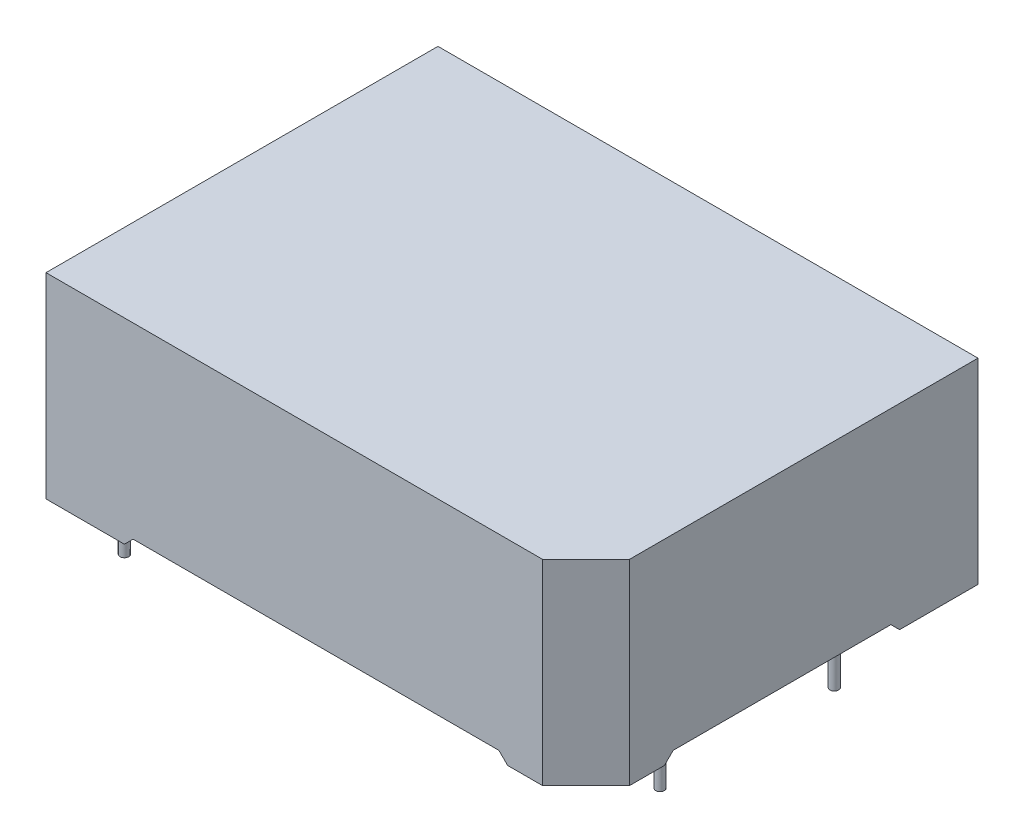
ISO-10303-21;
HEADER;
FILE_DESCRIPTION(('STEP AP214'),'2;1');
FILE_NAME('part.step','',(''),(''),'','','');
FILE_SCHEMA(('AUTOMOTIVE_DESIGN { 1 0 10303 214 1 1 1 1 }'));
ENDSEC;
DATA;
#1=APPLICATION_CONTEXT('core data for automotive mechanical design processes');
#2=APPLICATION_PROTOCOL_DEFINITION('international standard','automotive_design',2000,#1);
#3=PRODUCT_CONTEXT('',#1,'mechanical');
#4=PRODUCT('Part','Part','',(#3));
#5=PRODUCT_RELATED_PRODUCT_CATEGORY('part','',(#4));
#6=PRODUCT_DEFINITION_FORMATION('','',#4);
#7=PRODUCT_DEFINITION_CONTEXT('part definition',#1,'design');
#8=PRODUCT_DEFINITION('design','',#6,#7);
#9=PRODUCT_DEFINITION_SHAPE('','',#8);
#10=(LENGTH_UNIT() NAMED_UNIT(*) SI_UNIT(.MILLI.,.METRE.));
#11=(NAMED_UNIT(*) PLANE_ANGLE_UNIT() SI_UNIT($,.RADIAN.));
#12=(NAMED_UNIT(*) SI_UNIT($,.STERADIAN.) SOLID_ANGLE_UNIT());
#13=UNCERTAINTY_MEASURE_WITH_UNIT(LENGTH_MEASURE(1.E-05),#10,'distance_accuracy_value','');
#14=(GEOMETRIC_REPRESENTATION_CONTEXT(3) GLOBAL_UNCERTAINTY_ASSIGNED_CONTEXT((#13)) GLOBAL_UNIT_ASSIGNED_CONTEXT((#10,
#11,#12)) REPRESENTATION_CONTEXT('',''));
#15=CARTESIAN_POINT('',(0.,0.,0.));
#16=DIRECTION('',(0.,0.,1.));
#17=DIRECTION('',(1.,0.,0.));
#18=AXIS2_PLACEMENT_3D('',#15,#16,#17);
#19=CARTESIAN_POINT('',(27.,-6.,-10.));
#20=DIRECTION('',(0.,1.,0.));
#21=DIRECTION('',(0.,0.,1.));
#22=AXIS2_PLACEMENT_3D('',#19,#20,#21);
#23=CYLINDRICAL_SURFACE('',#22,0.499999999999999);
#24=CARTESIAN_POINT('',(27.,1.,-10.));
#25=DIRECTION('',(0.,-1.,0.));
#26=DIRECTION('',(0.,0.,-1.));
#27=AXIS2_PLACEMENT_3D('',#24,#25,#26);
#28=CIRCLE('',#27,0.499999999999999);
#29=CARTESIAN_POINT('',(27.,1.,-10.5));
#30=VERTEX_POINT('',#29);
#31=EDGE_CURVE('E10',#30,#30,#28,.T.);
#32=ORIENTED_EDGE('',*,*,#31,.T.);
#33=EDGE_LOOP('',(#32));
#34=FACE_BOUND('',#33,.T.);
#35=CARTESIAN_POINT('',(27.,-6.,-10.));
#36=DIRECTION('',(0.,-1.,0.));
#37=DIRECTION('',(0.,0.,1.));
#38=AXIS2_PLACEMENT_3D('',#35,#36,#37);
#39=CIRCLE('',#38,0.499999999999999);
#40=CARTESIAN_POINT('',(27.,-6.,-9.5));
#41=VERTEX_POINT('',#40);
#42=EDGE_CURVE('E486',#41,#41,#39,.T.);
#43=ORIENTED_EDGE('',*,*,#42,.F.);
#44=EDGE_LOOP('',(#43));
#45=FACE_BOUND('',#44,.T.);
#46=ADVANCED_FACE('F15',(#34,#45),#23,.T.);
#47=CARTESIAN_POINT('',(-27.,-6.,17.5));
#48=DIRECTION('',(0.,1.,0.));
#49=DIRECTION('',(0.,0.,1.));
#50=AXIS2_PLACEMENT_3D('',#47,#48,#49);
#51=CYLINDRICAL_SURFACE('',#50,0.5);
#52=CARTESIAN_POINT('',(-27.,1.,17.5));
#53=DIRECTION('',(0.,-1.,0.));
#54=DIRECTION('',(0.,0.,-1.));
#55=AXIS2_PLACEMENT_3D('',#52,#53,#54);
#56=CIRCLE('',#55,0.5);
#57=CARTESIAN_POINT('',(-27.,1.,17.));
#58=VERTEX_POINT('',#57);
#59=EDGE_CURVE('E25',#58,#58,#56,.T.);
#60=ORIENTED_EDGE('',*,*,#59,.T.);
#61=EDGE_LOOP('',(#60));
#62=FACE_BOUND('',#61,.T.);
#63=CARTESIAN_POINT('',(-27.,-6.,17.5));
#64=DIRECTION('',(0.,-1.,0.));
#65=DIRECTION('',(0.,0.,-1.));
#66=AXIS2_PLACEMENT_3D('',#63,#64,#65);
#67=CIRCLE('',#66,0.5);
#68=CARTESIAN_POINT('',(-27.,-6.,17.));
#69=VERTEX_POINT('',#68);
#70=EDGE_CURVE('E482',#69,#69,#67,.T.);
#71=ORIENTED_EDGE('',*,*,#70,.F.);
#72=EDGE_LOOP('',(#71));
#73=FACE_BOUND('',#72,.T.);
#74=ADVANCED_FACE('F494',(#62,#73),#51,.T.);
#75=CARTESIAN_POINT('',(-27.,-6.,0.));
#76=DIRECTION('',(0.,1.,0.));
#77=DIRECTION('',(0.,0.,1.));
#78=AXIS2_PLACEMENT_3D('',#75,#76,#77);
#79=CYLINDRICAL_SURFACE('',#78,0.499999999999999);
#80=CARTESIAN_POINT('',(-27.,1.,0.));
#81=DIRECTION('',(0.,-1.,0.));
#82=DIRECTION('',(0.,0.,-1.));
#83=AXIS2_PLACEMENT_3D('',#80,#81,#82);
#84=CIRCLE('',#83,0.499999999999999);
#85=CARTESIAN_POINT('',(-27.,1.,-0.499999999999999));
#86=VERTEX_POINT('',#85);
#87=EDGE_CURVE('E474',#86,#86,#84,.T.);
#88=ORIENTED_EDGE('',*,*,#87,.T.);
#89=EDGE_LOOP('',(#88));
#90=FACE_BOUND('',#89,.T.);
#91=CARTESIAN_POINT('',(-27.,-6.,0.));
#92=DIRECTION('',(0.,-1.,0.));
#93=DIRECTION('',(0.,0.,-1.));
#94=AXIS2_PLACEMENT_3D('',#91,#92,#93);
#95=CIRCLE('',#94,0.499999999999999);
#96=CARTESIAN_POINT('',(-27.,-6.,-0.499999999999999));
#97=VERTEX_POINT('',#96);
#98=EDGE_CURVE('E477',#97,#97,#95,.T.);
#99=ORIENTED_EDGE('',*,*,#98,.F.);
#100=EDGE_LOOP('',(#99));
#101=FACE_BOUND('',#100,.T.);
#102=ADVANCED_FACE('F503',(#90,#101),#79,.T.);
#103=CARTESIAN_POINT('',(27.,-6.,10.));
#104=DIRECTION('',(0.,1.,0.));
#105=DIRECTION('',(0.,0.,1.));
#106=AXIS2_PLACEMENT_3D('',#103,#104,#105);
#107=CYLINDRICAL_SURFACE('',#106,0.499999999999999);
#108=CARTESIAN_POINT('',(27.,1.,10.));
#109=DIRECTION('',(0.,-1.,0.));
#110=DIRECTION('',(0.,0.,-1.));
#111=AXIS2_PLACEMENT_3D('',#108,#109,#110);
#112=CIRCLE('',#111,0.499999999999999);
#113=CARTESIAN_POINT('',(27.,1.,9.5));
#114=VERTEX_POINT('',#113);
#115=EDGE_CURVE('E453',#114,#114,#112,.T.);
#116=ORIENTED_EDGE('',*,*,#115,.T.);
#117=EDGE_LOOP('',(#116));
#118=FACE_BOUND('',#117,.T.);
#119=CARTESIAN_POINT('',(27.,-6.,10.));
#120=DIRECTION('',(0.,-1.,0.));
#121=DIRECTION('',(0.,0.,-1.));
#122=AXIS2_PLACEMENT_3D('',#119,#120,#121);
#123=CIRCLE('',#122,0.499999999999999);
#124=CARTESIAN_POINT('',(27.,-6.,9.5));
#125=VERTEX_POINT('',#124);
#126=EDGE_CURVE('E410',#125,#125,#123,.T.);
#127=ORIENTED_EDGE('',*,*,#126,.F.);
#128=EDGE_LOOP('',(#127));
#129=FACE_BOUND('',#128,.T.);
#130=ADVANCED_FACE('F509',(#118,#129),#107,.T.);
#131=CARTESIAN_POINT('',(-31.,0.,22.5));
#132=DIRECTION('',(0.,1.,0.));
#133=DIRECTION('',(0.,0.,1.));
#134=AXIS2_PLACEMENT_3D('',#131,#132,#133);
#135=PLANE('',#134);
#136=DIRECTION('',(0.,0.,1.));
#137=VECTOR('',#136,1.);
#138=CARTESIAN_POINT('',(30.,0.,12.5));
#139=LINE('',#138,#137);
#140=CARTESIAN_POINT('',(30.,0.,13.5));
#141=VERTEX_POINT('',#140);
#142=CARTESIAN_POINT('',(30.,0.,17.085786437627));
#143=VERTEX_POINT('',#142);
#144=EDGE_CURVE('E34',#141,#143,#139,.T.);
#145=ORIENTED_EDGE('',*,*,#144,.F.);
#146=DIRECTION('',(1.,0.,0.));
#147=VECTOR('',#146,1.);
#148=CARTESIAN_POINT('',(-31.,0.,13.5));
#149=LINE('',#148,#147);
#150=CARTESIAN_POINT('',(31.,0.,13.5));
#151=VERTEX_POINT('',#150);
#152=EDGE_CURVE('E449',#141,#151,#149,.T.);
#153=ORIENTED_EDGE('',*,*,#152,.T.);
#154=DIRECTION('',(0.,0.,-1.));
#155=VECTOR('',#154,1.);
#156=CARTESIAN_POINT('',(31.,0.,-22.5));
#157=LINE('',#156,#155);
#158=CARTESIAN_POINT('',(31.,0.,17.5000000000001));
#159=VERTEX_POINT('',#158);
#160=EDGE_CURVE('E343',#159,#151,#157,.T.);
#161=ORIENTED_EDGE('',*,*,#160,.F.);
#162=DIRECTION('',(0.707106781186551,0.,-0.707106781186544));
#163=VECTOR('',#162,1.);
#164=CARTESIAN_POINT('',(31.,0.,17.5000000000001));
#165=LINE('',#164,#163);
#166=CARTESIAN_POINT('',(26.,0.,22.5));
#167=VERTEX_POINT('',#166);
#168=EDGE_CURVE('E416',#167,#159,#165,.T.);
#169=ORIENTED_EDGE('',*,*,#168,.F.);
#170=DIRECTION('',(1.,0.,0.));
#171=VECTOR('',#170,1.);
#172=CARTESIAN_POINT('',(-31.,0.,22.5));
#173=LINE('',#172,#171);
#174=CARTESIAN_POINT('',(22.,0.,22.5));
#175=VERTEX_POINT('',#174);
#176=EDGE_CURVE('E405',#175,#167,#173,.T.);
#177=ORIENTED_EDGE('',*,*,#176,.F.);
#178=DIRECTION('',(0.,0.,-1.));
#179=VECTOR('',#178,1.);
#180=CARTESIAN_POINT('',(22.,0.,22.5));
#181=LINE('',#180,#179);
#182=CARTESIAN_POINT('',(22.,0.,21.5));
#183=VERTEX_POINT('',#182);
#184=EDGE_CURVE('E379',#175,#183,#181,.T.);
#185=ORIENTED_EDGE('',*,*,#184,.T.);
#186=DIRECTION('',(-1.,0.,0.));
#187=VECTOR('',#186,1.);
#188=CARTESIAN_POINT('',(25.5857864376269,0.,21.5));
#189=LINE('',#188,#187);
#190=CARTESIAN_POINT('',(25.5857864376269,0.,21.5));
#191=VERTEX_POINT('',#190);
#192=EDGE_CURVE('E353',#191,#183,#189,.T.);
#193=ORIENTED_EDGE('',*,*,#192,.F.);
#194=DIRECTION('',(-0.707106781186551,0.,0.707106781186544));
#195=VECTOR('',#194,1.);
#196=CARTESIAN_POINT('',(30.,0.,17.085786437627));
#197=LINE('',#196,#195);
#198=EDGE_CURVE('E365',#143,#191,#197,.T.);
#199=ORIENTED_EDGE('',*,*,#198,.F.);
#200=EDGE_LOOP('',(#145,#153,#161,#169,#177,#185,#193,#199));
#201=FACE_BOUND('',#200,.T.);
#202=ADVANCED_FACE('F450',(#201),#135,.F.);
#203=CARTESIAN_POINT('',(-31.,0.,22.5));
#204=DIRECTION('',(0.,1.,0.));
#205=DIRECTION('',(0.,0.,1.));
#206=AXIS2_PLACEMENT_3D('',#203,#204,#205);
#207=PLANE('',#206);
#208=DIRECTION('',(1.,0.,0.));
#209=VECTOR('',#208,1.);
#210=CARTESIAN_POINT('',(21.,0.,-21.5));
#211=LINE('',#210,#209);
#212=CARTESIAN_POINT('',(22.,0.,-21.5));
#213=VERTEX_POINT('',#212);
#214=CARTESIAN_POINT('',(30.,0.,-21.5));
#215=VERTEX_POINT('',#214);
#216=EDGE_CURVE('E267',#213,#215,#211,.T.);
#217=ORIENTED_EDGE('',*,*,#216,.F.);
#218=DIRECTION('',(0.,0.,-1.));
#219=VECTOR('',#218,1.);
#220=CARTESIAN_POINT('',(22.,0.,22.5));
#221=LINE('',#220,#219);
#222=CARTESIAN_POINT('',(22.,0.,-22.5));
#223=VERTEX_POINT('',#222);
#224=EDGE_CURVE('E376',#213,#223,#221,.T.);
#225=ORIENTED_EDGE('',*,*,#224,.T.);
#226=DIRECTION('',(-1.,0.,0.));
#227=VECTOR('',#226,1.);
#228=CARTESIAN_POINT('',(-31.,0.,-22.5));
#229=LINE('',#228,#227);
#230=CARTESIAN_POINT('',(31.,0.,-22.5));
#231=VERTEX_POINT('',#230);
#232=EDGE_CURVE('E357',#231,#223,#229,.T.);
#233=ORIENTED_EDGE('',*,*,#232,.F.);
#234=DIRECTION('',(0.,0.,-1.));
#235=VECTOR('',#234,1.);
#236=CARTESIAN_POINT('',(31.,0.,-22.5));
#237=LINE('',#236,#235);
#238=CARTESIAN_POINT('',(31.,0.,-13.5));
#239=VERTEX_POINT('',#238);
#240=EDGE_CURVE('E382',#239,#231,#237,.T.);
#241=ORIENTED_EDGE('',*,*,#240,.F.);
#242=DIRECTION('',(-1.,0.,0.));
#243=VECTOR('',#242,1.);
#244=CARTESIAN_POINT('',(-31.,0.,-13.5));
#245=LINE('',#244,#243);
#246=CARTESIAN_POINT('',(30.,0.,-13.5));
#247=VERTEX_POINT('',#246);
#248=EDGE_CURVE('E380',#239,#247,#245,.T.);
#249=ORIENTED_EDGE('',*,*,#248,.T.);
#250=DIRECTION('',(0.,0.,1.));
#251=VECTOR('',#250,1.);
#252=CARTESIAN_POINT('',(30.,0.,-21.5));
#253=LINE('',#252,#251);
#254=EDGE_CURVE('E257',#215,#247,#253,.T.);
#255=ORIENTED_EDGE('',*,*,#254,.F.);
#256=EDGE_LOOP('',(#217,#225,#233,#241,#249,#255));
#257=FACE_BOUND('',#256,.T.);
#258=ADVANCED_FACE('F516',(#257),#207,.F.);
#259=CARTESIAN_POINT('',(-31.,0.,22.5));
#260=DIRECTION('',(0.,1.,0.));
#261=DIRECTION('',(0.,0.,1.));
#262=AXIS2_PLACEMENT_3D('',#259,#260,#261);
#263=PLANE('',#262);
#264=DIRECTION('',(-1.,0.,0.));
#265=VECTOR('',#264,1.);
#266=CARTESIAN_POINT('',(-31.,0.,-22.5));
#267=LINE('',#266,#265);
#268=CARTESIAN_POINT('',(-22.,0.,-22.5));
#269=VERTEX_POINT('',#268);
#270=CARTESIAN_POINT('',(-31.,0.,-22.5));
#271=VERTEX_POINT('',#270);
#272=EDGE_CURVE('E340',#269,#271,#267,.T.);
#273=ORIENTED_EDGE('',*,*,#272,.F.);
#274=DIRECTION('',(0.,0.,1.));
#275=VECTOR('',#274,1.);
#276=CARTESIAN_POINT('',(-22.,0.,22.5));
#277=LINE('',#276,#275);
#278=CARTESIAN_POINT('',(-22.,0.,-21.5));
#279=VERTEX_POINT('',#278);
#280=EDGE_CURVE('E337',#269,#279,#277,.T.);
#281=ORIENTED_EDGE('',*,*,#280,.T.);
#282=DIRECTION('',(1.,0.,0.));
#283=VECTOR('',#282,1.);
#284=CARTESIAN_POINT('',(-30.,0.,-21.5));
#285=LINE('',#284,#283);
#286=CARTESIAN_POINT('',(-30.,0.,-21.5));
#287=VERTEX_POINT('',#286);
#288=EDGE_CURVE('E271',#287,#279,#285,.T.);
#289=ORIENTED_EDGE('',*,*,#288,.F.);
#290=DIRECTION('',(0.,0.,-1.));
#291=VECTOR('',#290,1.);
#292=CARTESIAN_POINT('',(-30.,0.,-12.5));
#293=LINE('',#292,#291);
#294=CARTESIAN_POINT('',(-30.,0.,-13.5));
#295=VERTEX_POINT('',#294);
#296=EDGE_CURVE('E281',#295,#287,#293,.T.);
#297=ORIENTED_EDGE('',*,*,#296,.F.);
#298=DIRECTION('',(-1.,0.,0.));
#299=VECTOR('',#298,1.);
#300=CARTESIAN_POINT('',(-31.,0.,-13.5));
#301=LINE('',#300,#299);
#302=CARTESIAN_POINT('',(-31.,0.,-13.5));
#303=VERTEX_POINT('',#302);
#304=EDGE_CURVE('E301',#295,#303,#301,.T.);
#305=ORIENTED_EDGE('',*,*,#304,.T.);
#306=DIRECTION('',(0.,0.,1.));
#307=VECTOR('',#306,1.);
#308=CARTESIAN_POINT('',(-31.,0.,-22.5));
#309=LINE('',#308,#307);
#310=EDGE_CURVE('E314',#271,#303,#309,.T.);
#311=ORIENTED_EDGE('',*,*,#310,.F.);
#312=EDGE_LOOP('',(#273,#281,#289,#297,#305,#311));
#313=FACE_BOUND('',#312,.T.);
#314=ADVANCED_FACE('F519',(#313),#263,.F.);
#315=CARTESIAN_POINT('',(-31.,0.,22.5));
#316=DIRECTION('',(0.,1.,0.));
#317=DIRECTION('',(0.,0.,1.));
#318=AXIS2_PLACEMENT_3D('',#315,#316,#317);
#319=PLANE('',#318);
#320=DIRECTION('',(0.,0.,1.));
#321=VECTOR('',#320,1.);
#322=CARTESIAN_POINT('',(-31.,0.,-22.5));
#323=LINE('',#322,#321);
#324=CARTESIAN_POINT('',(-31.,0.,13.5));
#325=VERTEX_POINT('',#324);
#326=CARTESIAN_POINT('',(-31.,0.,22.5));
#327=VERTEX_POINT('',#326);
#328=EDGE_CURVE('E297',#325,#327,#323,.T.);
#329=ORIENTED_EDGE('',*,*,#328,.F.);
#330=DIRECTION('',(1.,0.,0.));
#331=VECTOR('',#330,1.);
#332=CARTESIAN_POINT('',(-31.,0.,13.5));
#333=LINE('',#332,#331);
#334=CARTESIAN_POINT('',(-30.,0.,13.5));
#335=VERTEX_POINT('',#334);
#336=EDGE_CURVE('E294',#325,#335,#333,.T.);
#337=ORIENTED_EDGE('',*,*,#336,.T.);
#338=DIRECTION('',(0.,0.,-1.));
#339=VECTOR('',#338,1.);
#340=CARTESIAN_POINT('',(-30.,0.,21.5));
#341=LINE('',#340,#339);
#342=CARTESIAN_POINT('',(-30.,0.,21.5));
#343=VERTEX_POINT('',#342);
#344=EDGE_CURVE('E284',#343,#335,#341,.T.);
#345=ORIENTED_EDGE('',*,*,#344,.F.);
#346=DIRECTION('',(-1.,0.,0.));
#347=VECTOR('',#346,1.);
#348=CARTESIAN_POINT('',(-21.,0.,21.5));
#349=LINE('',#348,#347);
#350=CARTESIAN_POINT('',(-22.,0.,21.5));
#351=VERTEX_POINT('',#350);
#352=EDGE_CURVE('E207',#351,#343,#349,.T.);
#353=ORIENTED_EDGE('',*,*,#352,.F.);
#354=DIRECTION('',(0.,0.,1.));
#355=VECTOR('',#354,1.);
#356=CARTESIAN_POINT('',(-22.,0.,22.5));
#357=LINE('',#356,#355);
#358=CARTESIAN_POINT('',(-22.,0.,22.5));
#359=VERTEX_POINT('',#358);
#360=EDGE_CURVE('E206',#351,#359,#357,.T.);
#361=ORIENTED_EDGE('',*,*,#360,.T.);
#362=DIRECTION('',(1.,0.,0.));
#363=VECTOR('',#362,1.);
#364=CARTESIAN_POINT('',(-31.,0.,22.5));
#365=LINE('',#364,#363);
#366=EDGE_CURVE('E398',#327,#359,#365,.T.);
#367=ORIENTED_EDGE('',*,*,#366,.F.);
#368=EDGE_LOOP('',(#329,#337,#345,#353,#361,#367));
#369=FACE_BOUND('',#368,.T.);
#370=ADVANCED_FACE('F295',(#369),#319,.F.);
#371=CARTESIAN_POINT('',(-31.,22.5,-22.5));
#372=DIRECTION('',(1.,0.,0.));
#373=DIRECTION('',(0.,0.,-1.));
#374=AXIS2_PLACEMENT_3D('',#371,#372,#373);
#375=PLANE('',#374);
#376=DIRECTION('',(0.,0.,-1.));
#377=VECTOR('',#376,1.);
#378=CARTESIAN_POINT('',(-31.,1.,12.5));
#379=LINE('',#378,#377);
#380=CARTESIAN_POINT('',(-31.,1.,12.5));
#381=VERTEX_POINT('',#380);
#382=CARTESIAN_POINT('',(-31.,1.,-12.5));
#383=VERTEX_POINT('',#382);
#384=EDGE_CURVE('E219',#381,#383,#379,.T.);
#385=ORIENTED_EDGE('',*,*,#384,.F.);
#386=DIRECTION('',(0.,-0.707106781186548,0.707106781186548));
#387=VECTOR('',#386,1.);
#388=CARTESIAN_POINT('',(-31.,0.999999999999994,12.5));
#389=LINE('',#388,#387);
#390=EDGE_CURVE('E304',#381,#325,#389,.T.);
#391=ORIENTED_EDGE('',*,*,#390,.T.);
#392=ORIENTED_EDGE('',*,*,#328,.T.);
#393=DIRECTION('',(0.,-1.,0.));
#394=VECTOR('',#393,1.);
#395=CARTESIAN_POINT('',(-31.,22.5,22.5));
#396=LINE('',#395,#394);
#397=CARTESIAN_POINT('',(-31.,22.5,22.5));
#398=VERTEX_POINT('',#397);
#399=EDGE_CURVE('E399',#398,#327,#396,.T.);
#400=ORIENTED_EDGE('',*,*,#399,.F.);
#401=DIRECTION('',(0.,0.,1.));
#402=VECTOR('',#401,1.);
#403=CARTESIAN_POINT('',(-31.,22.5,-22.5));
#404=LINE('',#403,#402);
#405=CARTESIAN_POINT('',(-31.,22.5,-22.5));
#406=VERTEX_POINT('',#405);
#407=EDGE_CURVE('E358',#406,#398,#404,.T.);
#408=ORIENTED_EDGE('',*,*,#407,.F.);
#409=DIRECTION('',(0.,-1.,0.));
#410=VECTOR('',#409,1.);
#411=CARTESIAN_POINT('',(-31.,22.5,-22.5));
#412=LINE('',#411,#410);
#413=EDGE_CURVE('E395',#406,#271,#412,.T.);
#414=ORIENTED_EDGE('',*,*,#413,.T.);
#415=ORIENTED_EDGE('',*,*,#310,.T.);
#416=DIRECTION('',(0.,0.707106781186548,0.707106781186547));
#417=VECTOR('',#416,1.);
#418=CARTESIAN_POINT('',(-31.,1.00000000000001,-12.5));
#419=LINE('',#418,#417);
#420=EDGE_CURVE('E310',#303,#383,#419,.T.);
#421=ORIENTED_EDGE('',*,*,#420,.T.);
#422=EDGE_LOOP('',(#385,#391,#392,#400,#408,#414,#415,#421));
#423=FACE_BOUND('',#422,.T.);
#424=ADVANCED_FACE('F311',(#423),#375,.F.);
#425=CARTESIAN_POINT('',(-31.,22.5,22.5));
#426=DIRECTION('',(0.,0.,-1.));
#427=DIRECTION('',(-1.,0.,0.));
#428=AXIS2_PLACEMENT_3D('',#425,#426,#427);
#429=PLANE('',#428);
#430=DIRECTION('',(-1.,0.,0.));
#431=VECTOR('',#430,1.);
#432=CARTESIAN_POINT('',(-21.,1.,22.5));
#433=LINE('',#432,#431);
#434=CARTESIAN_POINT('',(21.,1.,22.5));
#435=VERTEX_POINT('',#434);
#436=CARTESIAN_POINT('',(-21.,1.,22.5));
#437=VERTEX_POINT('',#436);
#438=EDGE_CURVE('E211',#435,#437,#433,.T.);
#439=ORIENTED_EDGE('',*,*,#438,.F.);
#440=DIRECTION('',(0.707106781186546,-0.707106781186549,0.));
#441=VECTOR('',#440,1.);
#442=CARTESIAN_POINT('',(21.,1.00000000000001,22.5));
#443=LINE('',#442,#441);
#444=EDGE_CURVE('E318',#435,#175,#443,.T.);
#445=ORIENTED_EDGE('',*,*,#444,.T.);
#446=ORIENTED_EDGE('',*,*,#176,.T.);
#447=DIRECTION('',(0.,-1.,0.));
#448=VECTOR('',#447,1.);
#449=CARTESIAN_POINT('',(26.,22.5,22.5));
#450=LINE('',#449,#448);
#451=CARTESIAN_POINT('',(26.,22.5,22.5));
#452=VERTEX_POINT('',#451);
#453=EDGE_CURVE('E413',#452,#167,#450,.T.);
#454=ORIENTED_EDGE('',*,*,#453,.F.);
#455=DIRECTION('',(1.,0.,0.));
#456=VECTOR('',#455,1.);
#457=CARTESIAN_POINT('',(-31.,22.5,22.5));
#458=LINE('',#457,#456);
#459=EDGE_CURVE('E407',#398,#452,#458,.T.);
#460=ORIENTED_EDGE('',*,*,#459,.F.);
#461=ORIENTED_EDGE('',*,*,#399,.T.);
#462=ORIENTED_EDGE('',*,*,#366,.T.);
#463=DIRECTION('',(0.707106781186548,0.707106781186548,0.));
#464=VECTOR('',#463,1.);
#465=CARTESIAN_POINT('',(-21.,1.00000000000001,22.5));
#466=LINE('',#465,#464);
#467=EDGE_CURVE('E400',#359,#437,#466,.T.);
#468=ORIENTED_EDGE('',*,*,#467,.T.);
#469=EDGE_LOOP('',(#439,#445,#446,#454,#460,#461,#462,#468));
#470=FACE_BOUND('',#469,.T.);
#471=ADVANCED_FACE('F443',(#470),#429,.F.);
#472=CARTESIAN_POINT('',(31.,22.5,17.5000000000001));
#473=DIRECTION('',(-0.707106781186544,0.,-0.707106781186551));
#474=DIRECTION('',(-0.707106781186551,0.,0.707106781186544));
#475=AXIS2_PLACEMENT_3D('',#472,#473,#474);
#476=PLANE('',#475);
#477=ORIENTED_EDGE('',*,*,#168,.T.);
#478=DIRECTION('',(0.,-1.,0.));
#479=VECTOR('',#478,1.);
#480=CARTESIAN_POINT('',(31.,22.5,17.5000000000001));
#481=LINE('',#480,#479);
#482=CARTESIAN_POINT('',(31.,22.5,17.5000000000001));
#483=VERTEX_POINT('',#482);
#484=EDGE_CURVE('E386',#483,#159,#481,.T.);
#485=ORIENTED_EDGE('',*,*,#484,.F.);
#486=DIRECTION('',(0.707106781186551,0.,-0.707106781186544));
#487=VECTOR('',#486,1.);
#488=CARTESIAN_POINT('',(31.,22.5,17.5000000000001));
#489=LINE('',#488,#487);
#490=EDGE_CURVE('E418',#452,#483,#489,.T.);
#491=ORIENTED_EDGE('',*,*,#490,.F.);
#492=ORIENTED_EDGE('',*,*,#453,.T.);
#493=EDGE_LOOP('',(#477,#485,#491,#492));
#494=FACE_BOUND('',#493,.T.);
#495=ADVANCED_FACE('F446',(#494),#476,.F.);
#496=CARTESIAN_POINT('',(31.,22.5,-22.5));
#497=DIRECTION('',(-1.,0.,0.));
#498=DIRECTION('',(0.,0.,1.));
#499=AXIS2_PLACEMENT_3D('',#496,#497,#498);
#500=PLANE('',#499);
#501=DIRECTION('',(0.,0.,1.));
#502=VECTOR('',#501,1.);
#503=CARTESIAN_POINT('',(31.,1.,12.5));
#504=LINE('',#503,#502);
#505=CARTESIAN_POINT('',(31.,1.,-12.5));
#506=VERTEX_POINT('',#505);
#507=CARTESIAN_POINT('',(31.,1.,12.5));
#508=VERTEX_POINT('',#507);
#509=EDGE_CURVE('E236',#506,#508,#504,.T.);
#510=ORIENTED_EDGE('',*,*,#509,.F.);
#511=DIRECTION('',(0.,-0.707106781186548,-0.707106781186547));
#512=VECTOR('',#511,1.);
#513=CARTESIAN_POINT('',(31.,1.00000000000001,-12.5));
#514=LINE('',#513,#512);
#515=EDGE_CURVE('E385',#506,#239,#514,.T.);
#516=ORIENTED_EDGE('',*,*,#515,.T.);
#517=ORIENTED_EDGE('',*,*,#240,.T.);
#518=DIRECTION('',(0.,-1.,0.));
#519=VECTOR('',#518,1.);
#520=CARTESIAN_POINT('',(31.,22.5,-22.5));
#521=LINE('',#520,#519);
#522=CARTESIAN_POINT('',(31.,22.5,-22.5));
#523=VERTEX_POINT('',#522);
#524=EDGE_CURVE('E345',#523,#231,#521,.T.);
#525=ORIENTED_EDGE('',*,*,#524,.F.);
#526=DIRECTION('',(0.,0.,-1.));
#527=VECTOR('',#526,1.);
#528=CARTESIAN_POINT('',(31.,22.5,-22.5));
#529=LINE('',#528,#527);
#530=EDGE_CURVE('E352',#483,#523,#529,.T.);
#531=ORIENTED_EDGE('',*,*,#530,.F.);
#532=ORIENTED_EDGE('',*,*,#484,.T.);
#533=ORIENTED_EDGE('',*,*,#160,.T.);
#534=DIRECTION('',(0.,0.707106781186548,-0.707106781186548));
#535=VECTOR('',#534,1.);
#536=CARTESIAN_POINT('',(31.,0.999999999999994,12.5));
#537=LINE('',#536,#535);
#538=EDGE_CURVE('E339',#151,#508,#537,.T.);
#539=ORIENTED_EDGE('',*,*,#538,.T.);
#540=EDGE_LOOP('',(#510,#516,#517,#525,#531,#532,#533,#539));
#541=FACE_BOUND('',#540,.T.);
#542=ADVANCED_FACE('F435',(#541),#500,.F.);
#543=CARTESIAN_POINT('',(-31.,22.5,-22.5));
#544=DIRECTION('',(0.,0.,1.));
#545=DIRECTION('',(1.,0.,0.));
#546=AXIS2_PLACEMENT_3D('',#543,#544,#545);
#547=PLANE('',#546);
#548=DIRECTION('',(1.,0.,0.));
#549=VECTOR('',#548,1.);
#550=CARTESIAN_POINT('',(21.,1.,-22.5));
#551=LINE('',#550,#549);
#552=CARTESIAN_POINT('',(-21.,1.,-22.5));
#553=VERTEX_POINT('',#552);
#554=CARTESIAN_POINT('',(21.,1.,-22.5));
#555=VERTEX_POINT('',#554);
#556=EDGE_CURVE('E228',#553,#555,#551,.T.);
#557=ORIENTED_EDGE('',*,*,#556,.F.);
#558=DIRECTION('',(-0.707106781186548,-0.707106781186548,0.));
#559=VECTOR('',#558,1.);
#560=CARTESIAN_POINT('',(-21.,0.999999999999994,-22.5));
#561=LINE('',#560,#559);
#562=EDGE_CURVE('E336',#553,#269,#561,.T.);
#563=ORIENTED_EDGE('',*,*,#562,.T.);
#564=ORIENTED_EDGE('',*,*,#272,.T.);
#565=ORIENTED_EDGE('',*,*,#413,.F.);
#566=DIRECTION('',(-1.,0.,0.));
#567=VECTOR('',#566,1.);
#568=CARTESIAN_POINT('',(-31.,22.5,-22.5));
#569=LINE('',#568,#567);
#570=EDGE_CURVE('E349',#523,#406,#569,.T.);
#571=ORIENTED_EDGE('',*,*,#570,.F.);
#572=ORIENTED_EDGE('',*,*,#524,.T.);
#573=ORIENTED_EDGE('',*,*,#232,.T.);
#574=DIRECTION('',(-0.707106781186549,0.707106781186546,0.));
#575=VECTOR('',#574,1.);
#576=CARTESIAN_POINT('',(21.,0.999999999999994,-22.5));
#577=LINE('',#576,#575);
#578=EDGE_CURVE('E354',#223,#555,#577,.T.);
#579=ORIENTED_EDGE('',*,*,#578,.T.);
#580=EDGE_LOOP('',(#557,#563,#564,#565,#571,#572,#573,#579));
#581=FACE_BOUND('',#580,.T.);
#582=ADVANCED_FACE('F437',(#581),#547,.F.);
#583=CARTESIAN_POINT('',(-31.,22.5,22.5));
#584=DIRECTION('',(0.,1.,0.));
#585=DIRECTION('',(0.,0.,1.));
#586=AXIS2_PLACEMENT_3D('',#583,#584,#585);
#587=PLANE('',#586);
#588=ORIENTED_EDGE('',*,*,#407,.T.);
#589=ORIENTED_EDGE('',*,*,#459,.T.);
#590=ORIENTED_EDGE('',*,*,#490,.T.);
#591=ORIENTED_EDGE('',*,*,#530,.T.);
#592=ORIENTED_EDGE('',*,*,#570,.T.);
#593=EDGE_LOOP('',(#588,#589,#590,#591,#592));
#594=FACE_BOUND('',#593,.T.);
#595=ADVANCED_FACE('F430',(#594),#587,.T.);
#596=CARTESIAN_POINT('',(25.5857864376269,1.,21.5));
#597=DIRECTION('',(0.,0.,1.));
#598=DIRECTION('',(1.,0.,0.));
#599=AXIS2_PLACEMENT_3D('',#596,#597,#598);
#600=PLANE('',#599);
#601=ORIENTED_EDGE('',*,*,#192,.T.);
#602=DIRECTION('',(-0.707106781186546,0.707106781186549,0.));
#603=VECTOR('',#602,1.);
#604=CARTESIAN_POINT('',(21.,1.00000000000001,21.5));
#605=LINE('',#604,#603);
#606=CARTESIAN_POINT('',(21.,1.,21.5));
#607=VERTEX_POINT('',#606);
#608=EDGE_CURVE('E359',#183,#607,#605,.T.);
#609=ORIENTED_EDGE('',*,*,#608,.T.);
#610=DIRECTION('',(-1.,0.,0.));
#611=VECTOR('',#610,1.);
#612=CARTESIAN_POINT('',(25.5857864376269,1.,21.5));
#613=LINE('',#612,#611);
#614=CARTESIAN_POINT('',(25.5857864376269,1.,21.5));
#615=VERTEX_POINT('',#614);
#616=EDGE_CURVE('E246',#615,#607,#613,.T.);
#617=ORIENTED_EDGE('',*,*,#616,.F.);
#618=DIRECTION('',(0.,-1.,0.));
#619=VECTOR('',#618,1.);
#620=CARTESIAN_POINT('',(25.5857864376269,1.,21.5));
#621=LINE('',#620,#619);
#622=EDGE_CURVE('E362',#615,#191,#621,.T.);
#623=ORIENTED_EDGE('',*,*,#622,.T.);
#624=EDGE_LOOP('',(#601,#609,#617,#623));
#625=FACE_BOUND('',#624,.T.);
#626=ADVANCED_FACE('F462',(#625),#600,.F.);
#627=CARTESIAN_POINT('',(30.,1.,17.085786437627));
#628=DIRECTION('',(0.707106781186544,0.,0.707106781186551));
#629=DIRECTION('',(0.707106781186551,0.,-0.707106781186544));
#630=AXIS2_PLACEMENT_3D('',#627,#628,#629);
#631=PLANE('',#630);
#632=ORIENTED_EDGE('',*,*,#198,.T.);
#633=ORIENTED_EDGE('',*,*,#622,.F.);
#634=DIRECTION('',(-0.707106781186551,0.,0.707106781186544));
#635=VECTOR('',#634,1.);
#636=CARTESIAN_POINT('',(30.,1.,17.085786437627));
#637=LINE('',#636,#635);
#638=CARTESIAN_POINT('',(30.,1.,17.085786437627));
#639=VERTEX_POINT('',#638);
#640=EDGE_CURVE('E243',#639,#615,#637,.T.);
#641=ORIENTED_EDGE('',*,*,#640,.F.);
#642=DIRECTION('',(0.,-1.,0.));
#643=VECTOR('',#642,1.);
#644=CARTESIAN_POINT('',(30.,1.,17.085786437627));
#645=LINE('',#644,#643);
#646=EDGE_CURVE('E250',#639,#143,#645,.T.);
#647=ORIENTED_EDGE('',*,*,#646,.T.);
#648=EDGE_LOOP('',(#632,#633,#641,#647));
#649=FACE_BOUND('',#648,.T.);
#650=ADVANCED_FACE('F459',(#649),#631,.F.);
#651=CARTESIAN_POINT('',(30.,1.,12.5));
#652=DIRECTION('',(1.,0.,0.));
#653=DIRECTION('',(0.,0.,-1.));
#654=AXIS2_PLACEMENT_3D('',#651,#652,#653);
#655=PLANE('',#654);
#656=DIRECTION('',(0.,0.,1.));
#657=VECTOR('',#656,1.);
#658=CARTESIAN_POINT('',(30.,1.,12.5));
#659=LINE('',#658,#657);
#660=CARTESIAN_POINT('',(30.,1.,12.5));
#661=VERTEX_POINT('',#660);
#662=EDGE_CURVE('E239',#661,#639,#659,.T.);
#663=ORIENTED_EDGE('',*,*,#662,.F.);
#664=DIRECTION('',(0.,-0.707106781186548,0.707106781186548));
#665=VECTOR('',#664,1.);
#666=CARTESIAN_POINT('',(30.,0.999999999999995,12.5));
#667=LINE('',#666,#665);
#668=EDGE_CURVE('E251',#661,#141,#667,.T.);
#669=ORIENTED_EDGE('',*,*,#668,.T.);
#670=ORIENTED_EDGE('',*,*,#144,.T.);
#671=ORIENTED_EDGE('',*,*,#646,.F.);
#672=EDGE_LOOP('',(#663,#669,#670,#671));
#673=FACE_BOUND('',#672,.T.);
#674=ADVANCED_FACE('F457',(#673),#655,.F.);
#675=CARTESIAN_POINT('',(30.,1.,-21.5));
#676=DIRECTION('',(1.,0.,0.));
#677=DIRECTION('',(0.,0.,-1.));
#678=AXIS2_PLACEMENT_3D('',#675,#676,#677);
#679=PLANE('',#678);
#680=ORIENTED_EDGE('',*,*,#254,.T.);
#681=DIRECTION('',(0.,0.707106781186548,0.707106781186547));
#682=VECTOR('',#681,1.);
#683=CARTESIAN_POINT('',(30.,1.00000000000001,-12.5));
#684=LINE('',#683,#682);
#685=CARTESIAN_POINT('',(30.,1.,-12.5));
#686=VERTEX_POINT('',#685);
#687=EDGE_CURVE('E254',#247,#686,#684,.T.);
#688=ORIENTED_EDGE('',*,*,#687,.T.);
#689=DIRECTION('',(0.,0.,1.));
#690=VECTOR('',#689,1.);
#691=CARTESIAN_POINT('',(30.,1.,-21.5));
#692=LINE('',#691,#690);
#693=CARTESIAN_POINT('',(30.,1.,-21.5));
#694=VERTEX_POINT('',#693);
#695=EDGE_CURVE('E235',#694,#686,#692,.T.);
#696=ORIENTED_EDGE('',*,*,#695,.F.);
#697=DIRECTION('',(0.,-1.,0.));
#698=VECTOR('',#697,1.);
#699=CARTESIAN_POINT('',(30.,1.,-21.5));
#700=LINE('',#699,#698);
#701=EDGE_CURVE('E258',#694,#215,#700,.T.);
#702=ORIENTED_EDGE('',*,*,#701,.T.);
#703=EDGE_LOOP('',(#680,#688,#696,#702));
#704=FACE_BOUND('',#703,.T.);
#705=ADVANCED_FACE('F544',(#704),#679,.F.);
#706=CARTESIAN_POINT('',(21.,1.,-21.5));
#707=DIRECTION('',(0.,0.,-1.));
#708=DIRECTION('',(-1.,0.,0.));
#709=AXIS2_PLACEMENT_3D('',#706,#707,#708);
#710=PLANE('',#709);
#711=DIRECTION('',(1.,0.,0.));
#712=VECTOR('',#711,1.);
#713=CARTESIAN_POINT('',(21.,1.,-21.5));
#714=LINE('',#713,#712);
#715=CARTESIAN_POINT('',(21.,1.,-21.5));
#716=VERTEX_POINT('',#715);
#717=EDGE_CURVE('E232',#716,#694,#714,.T.);
#718=ORIENTED_EDGE('',*,*,#717,.F.);
#719=DIRECTION('',(0.707106781186549,-0.707106781186546,0.));
#720=VECTOR('',#719,1.);
#721=CARTESIAN_POINT('',(21.,0.999999999999994,-21.5));
#722=LINE('',#721,#720);
#723=EDGE_CURVE('E262',#716,#213,#722,.T.);
#724=ORIENTED_EDGE('',*,*,#723,.T.);
#725=ORIENTED_EDGE('',*,*,#216,.T.);
#726=ORIENTED_EDGE('',*,*,#701,.F.);
#727=EDGE_LOOP('',(#718,#724,#725,#726));
#728=FACE_BOUND('',#727,.T.);
#729=ADVANCED_FACE('F547',(#728),#710,.F.);
#730=CARTESIAN_POINT('',(-30.,1.,-21.5));
#731=DIRECTION('',(0.,0.,-1.));
#732=DIRECTION('',(-1.,0.,0.));
#733=AXIS2_PLACEMENT_3D('',#730,#731,#732);
#734=PLANE('',#733);
#735=ORIENTED_EDGE('',*,*,#288,.T.);
#736=DIRECTION('',(0.707106781186548,0.707106781186548,0.));
#737=VECTOR('',#736,1.);
#738=CARTESIAN_POINT('',(-21.,0.999999999999994,-21.5));
#739=LINE('',#738,#737);
#740=CARTESIAN_POINT('',(-21.,1.,-21.5));
#741=VERTEX_POINT('',#740);
#742=EDGE_CURVE('E268',#279,#741,#739,.T.);
#743=ORIENTED_EDGE('',*,*,#742,.T.);
#744=DIRECTION('',(1.,0.,0.));
#745=VECTOR('',#744,1.);
#746=CARTESIAN_POINT('',(-30.,1.,-21.5));
#747=LINE('',#746,#745);
#748=CARTESIAN_POINT('',(-30.,1.,-21.5));
#749=VERTEX_POINT('',#748);
#750=EDGE_CURVE('E227',#749,#741,#747,.T.);
#751=ORIENTED_EDGE('',*,*,#750,.F.);
#752=DIRECTION('',(0.,-1.,0.));
#753=VECTOR('',#752,1.);
#754=CARTESIAN_POINT('',(-30.,1.,-21.5));
#755=LINE('',#754,#753);
#756=EDGE_CURVE('E272',#749,#287,#755,.T.);
#757=ORIENTED_EDGE('',*,*,#756,.T.);
#758=EDGE_LOOP('',(#735,#743,#751,#757));
#759=FACE_BOUND('',#758,.T.);
#760=ADVANCED_FACE('F329',(#759),#734,.F.);
#761=CARTESIAN_POINT('',(-30.,1.,-12.5));
#762=DIRECTION('',(-1.,0.,0.));
#763=DIRECTION('',(0.,0.,1.));
#764=AXIS2_PLACEMENT_3D('',#761,#762,#763);
#765=PLANE('',#764);
#766=DIRECTION('',(0.,0.,-1.));
#767=VECTOR('',#766,1.);
#768=CARTESIAN_POINT('',(-30.,1.,-12.5));
#769=LINE('',#768,#767);
#770=CARTESIAN_POINT('',(-30.,1.,-12.5));
#771=VERTEX_POINT('',#770);
#772=EDGE_CURVE('E223',#771,#749,#769,.T.);
#773=ORIENTED_EDGE('',*,*,#772,.F.);
#774=DIRECTION('',(0.,-0.707106781186548,-0.707106781186547));
#775=VECTOR('',#774,1.);
#776=CARTESIAN_POINT('',(-30.,1.00000000000001,-12.5));
#777=LINE('',#776,#775);
#778=EDGE_CURVE('E276',#771,#295,#777,.T.);
#779=ORIENTED_EDGE('',*,*,#778,.T.);
#780=ORIENTED_EDGE('',*,*,#296,.T.);
#781=ORIENTED_EDGE('',*,*,#756,.F.);
#782=EDGE_LOOP('',(#773,#779,#780,#781));
#783=FACE_BOUND('',#782,.T.);
#784=ADVANCED_FACE('F323',(#783),#765,.F.);
#785=CARTESIAN_POINT('',(-30.,1.,21.5));
#786=DIRECTION('',(-1.,0.,0.));
#787=DIRECTION('',(0.,0.,1.));
#788=AXIS2_PLACEMENT_3D('',#785,#786,#787);
#789=PLANE('',#788);
#790=ORIENTED_EDGE('',*,*,#344,.T.);
#791=DIRECTION('',(0.,0.707106781186548,-0.707106781186548));
#792=VECTOR('',#791,1.);
#793=CARTESIAN_POINT('',(-30.,0.999999999999995,12.5));
#794=LINE('',#793,#792);
#795=CARTESIAN_POINT('',(-30.,1.,12.5));
#796=VERTEX_POINT('',#795);
#797=EDGE_CURVE('E282',#335,#796,#794,.T.);
#798=ORIENTED_EDGE('',*,*,#797,.T.);
#799=DIRECTION('',(0.,0.,-1.));
#800=VECTOR('',#799,1.);
#801=CARTESIAN_POINT('',(-30.,1.,21.5));
#802=LINE('',#801,#800);
#803=CARTESIAN_POINT('',(-30.,1.,21.5));
#804=VERTEX_POINT('',#803);
#805=EDGE_CURVE('E186',#804,#796,#802,.T.);
#806=ORIENTED_EDGE('',*,*,#805,.F.);
#807=DIRECTION('',(0.,-1.,0.));
#808=VECTOR('',#807,1.);
#809=CARTESIAN_POINT('',(-30.,1.,21.5));
#810=LINE('',#809,#808);
#811=EDGE_CURVE('E196',#804,#343,#810,.T.);
#812=ORIENTED_EDGE('',*,*,#811,.T.);
#813=EDGE_LOOP('',(#790,#798,#806,#812));
#814=FACE_BOUND('',#813,.T.);
#815=ADVANCED_FACE('F286',(#814),#789,.F.);
#816=CARTESIAN_POINT('',(-21.,1.,21.5));
#817=DIRECTION('',(0.,0.,1.));
#818=DIRECTION('',(1.,0.,0.));
#819=AXIS2_PLACEMENT_3D('',#816,#817,#818);
#820=PLANE('',#819);
#821=DIRECTION('',(-1.,0.,0.));
#822=VECTOR('',#821,1.);
#823=CARTESIAN_POINT('',(-21.,1.,21.5));
#824=LINE('',#823,#822);
#825=CARTESIAN_POINT('',(-21.,1.,21.5));
#826=VERTEX_POINT('',#825);
#827=EDGE_CURVE('E192',#826,#804,#824,.T.);
#828=ORIENTED_EDGE('',*,*,#827,.F.);
#829=DIRECTION('',(-0.707106781186548,-0.707106781186548,0.));
#830=VECTOR('',#829,1.);
#831=CARTESIAN_POINT('',(-21.,1.00000000000001,21.5));
#832=LINE('',#831,#830);
#833=EDGE_CURVE('E195',#826,#351,#832,.T.);
#834=ORIENTED_EDGE('',*,*,#833,.T.);
#835=ORIENTED_EDGE('',*,*,#352,.T.);
#836=ORIENTED_EDGE('',*,*,#811,.F.);
#837=EDGE_LOOP('',(#828,#834,#835,#836));
#838=FACE_BOUND('',#837,.T.);
#839=ADVANCED_FACE('F194',(#838),#820,.F.);
#840=CARTESIAN_POINT('',(-21.,1.,21.5));
#841=DIRECTION('',(0.,1.,0.));
#842=DIRECTION('',(0.,0.,1.));
#843=AXIS2_PLACEMENT_3D('',#840,#841,#842);
#844=PLANE('',#843);
#845=ORIENTED_EDGE('',*,*,#115,.F.);
#846=EDGE_LOOP('',(#845));
#847=FACE_BOUND('',#846,.T.);
#848=ORIENTED_EDGE('',*,*,#31,.F.);
#849=EDGE_LOOP('',(#848));
#850=FACE_BOUND('',#849,.T.);
#851=ORIENTED_EDGE('',*,*,#59,.F.);
#852=EDGE_LOOP('',(#851));
#853=FACE_BOUND('',#852,.T.);
#854=ORIENTED_EDGE('',*,*,#87,.F.);
#855=EDGE_LOOP('',(#854));
#856=FACE_BOUND('',#855,.T.);
#857=DIRECTION('',(0.,0.,-1.));
#858=VECTOR('',#857,1.);
#859=CARTESIAN_POINT('',(-21.,1.,22.5));
#860=LINE('',#859,#858);
#861=EDGE_CURVE('E199',#437,#826,#860,.T.);
#862=ORIENTED_EDGE('',*,*,#861,.T.);
#863=ORIENTED_EDGE('',*,*,#827,.T.);
#864=ORIENTED_EDGE('',*,*,#805,.T.);
#865=DIRECTION('',(-1.,0.,0.));
#866=VECTOR('',#865,1.);
#867=CARTESIAN_POINT('',(-31.,1.,12.5));
#868=LINE('',#867,#866);
#869=EDGE_CURVE('E216',#796,#381,#868,.T.);
#870=ORIENTED_EDGE('',*,*,#869,.T.);
#871=ORIENTED_EDGE('',*,*,#384,.T.);
#872=DIRECTION('',(1.,0.,0.));
#873=VECTOR('',#872,1.);
#874=CARTESIAN_POINT('',(-31.,1.,-12.5));
#875=LINE('',#874,#873);
#876=EDGE_CURVE('E220',#383,#771,#875,.T.);
#877=ORIENTED_EDGE('',*,*,#876,.T.);
#878=ORIENTED_EDGE('',*,*,#772,.T.);
#879=ORIENTED_EDGE('',*,*,#750,.T.);
#880=DIRECTION('',(0.,0.,-1.));
#881=VECTOR('',#880,1.);
#882=CARTESIAN_POINT('',(-21.,1.,-22.5));
#883=LINE('',#882,#881);
#884=EDGE_CURVE('E224',#741,#553,#883,.T.);
#885=ORIENTED_EDGE('',*,*,#884,.T.);
#886=ORIENTED_EDGE('',*,*,#556,.T.);
#887=DIRECTION('',(0.,0.,1.));
#888=VECTOR('',#887,1.);
#889=CARTESIAN_POINT('',(21.,1.,-22.5));
#890=LINE('',#889,#888);
#891=EDGE_CURVE('E229',#555,#716,#890,.T.);
#892=ORIENTED_EDGE('',*,*,#891,.T.);
#893=ORIENTED_EDGE('',*,*,#717,.T.);
#894=ORIENTED_EDGE('',*,*,#695,.T.);
#895=DIRECTION('',(1.,0.,0.));
#896=VECTOR('',#895,1.);
#897=CARTESIAN_POINT('',(31.,1.,-12.5));
#898=LINE('',#897,#896);
#899=EDGE_CURVE('E233',#686,#506,#898,.T.);
#900=ORIENTED_EDGE('',*,*,#899,.T.);
#901=ORIENTED_EDGE('',*,*,#509,.T.);
#902=DIRECTION('',(-1.,0.,0.));
#903=VECTOR('',#902,1.);
#904=CARTESIAN_POINT('',(31.,1.,12.5));
#905=LINE('',#904,#903);
#906=EDGE_CURVE('E237',#508,#661,#905,.T.);
#907=ORIENTED_EDGE('',*,*,#906,.T.);
#908=ORIENTED_EDGE('',*,*,#662,.T.);
#909=ORIENTED_EDGE('',*,*,#640,.T.);
#910=ORIENTED_EDGE('',*,*,#616,.T.);
#911=DIRECTION('',(0.,0.,1.));
#912=VECTOR('',#911,1.);
#913=CARTESIAN_POINT('',(21.,1.,22.5));
#914=LINE('',#913,#912);
#915=EDGE_CURVE('E19',#607,#435,#914,.T.);
#916=ORIENTED_EDGE('',*,*,#915,.T.);
#917=ORIENTED_EDGE('',*,*,#438,.T.);
#918=EDGE_LOOP('',(#862,#863,#864,#870,#871,#877,#878,#879,#885,#886,#892,#893,#894,#900,#901,
#907,#908,#909,#910,#916,#917));
#919=FACE_BOUND('',#918,.T.);
#920=ADVANCED_FACE('F209',(#847,#850,#853,#856,#919),#844,.F.);
#921=CARTESIAN_POINT('',(27.,-6.,10.));
#922=DIRECTION('',(0.,-1.,0.));
#923=DIRECTION('',(0.,0.,-1.));
#924=AXIS2_PLACEMENT_3D('',#921,#922,#923);
#925=PLANE('',#924);
#926=ORIENTED_EDGE('',*,*,#126,.T.);
#927=EDGE_LOOP('',(#926));
#928=FACE_BOUND('',#927,.T.);
#929=ADVANCED_FACE('F562',(#928),#925,.T.);
#930=CARTESIAN_POINT('',(-27.,-6.,0.));
#931=DIRECTION('',(0.,-1.,0.));
#932=DIRECTION('',(0.,0.,-1.));
#933=AXIS2_PLACEMENT_3D('',#930,#931,#932);
#934=PLANE('',#933);
#935=ORIENTED_EDGE('',*,*,#98,.T.);
#936=EDGE_LOOP('',(#935));
#937=FACE_BOUND('',#936,.T.);
#938=ADVANCED_FACE('F566',(#937),#934,.T.);
#939=CARTESIAN_POINT('',(-27.,-6.,17.5));
#940=DIRECTION('',(0.,-1.,0.));
#941=DIRECTION('',(0.,0.,-1.));
#942=AXIS2_PLACEMENT_3D('',#939,#940,#941);
#943=PLANE('',#942);
#944=ORIENTED_EDGE('',*,*,#70,.T.);
#945=EDGE_LOOP('',(#944));
#946=FACE_BOUND('',#945,.T.);
#947=ADVANCED_FACE('F570',(#946),#943,.T.);
#948=CARTESIAN_POINT('',(27.,-6.,-10.));
#949=DIRECTION('',(0.,1.,0.));
#950=DIRECTION('',(0.,0.,1.));
#951=AXIS2_PLACEMENT_3D('',#948,#949,#950);
#952=PLANE('',#951);
#953=ORIENTED_EDGE('',*,*,#42,.T.);
#954=EDGE_LOOP('',(#953));
#955=FACE_BOUND('',#954,.T.);
#956=ADVANCED_FACE('F491',(#955),#952,.F.);
#957=CARTESIAN_POINT('',(-31.,0.999999999999994,12.5));
#958=DIRECTION('',(0.,0.707106781186548,0.707106781186548));
#959=DIRECTION('',(0.,-0.707106781186548,0.707106781186548));
#960=AXIS2_PLACEMENT_3D('',#957,#958,#959);
#961=PLANE('',#960);
#962=ORIENTED_EDGE('',*,*,#797,.F.);
#963=ORIENTED_EDGE('',*,*,#336,.F.);
#964=ORIENTED_EDGE('',*,*,#390,.F.);
#965=ORIENTED_EDGE('',*,*,#869,.F.);
#966=EDGE_LOOP('',(#962,#963,#964,#965));
#967=FACE_BOUND('',#966,.T.);
#968=ADVANCED_FACE('F303',(#967),#961,.F.);
#969=CARTESIAN_POINT('',(-21.,0.999999999999994,-22.5));
#970=DIRECTION('',(-0.707106781186548,0.707106781186548,0.));
#971=DIRECTION('',(-0.707106781186548,-0.707106781186548,0.));
#972=AXIS2_PLACEMENT_3D('',#969,#970,#971);
#973=PLANE('',#972);
#974=ORIENTED_EDGE('',*,*,#742,.F.);
#975=ORIENTED_EDGE('',*,*,#280,.F.);
#976=ORIENTED_EDGE('',*,*,#562,.F.);
#977=ORIENTED_EDGE('',*,*,#884,.F.);
#978=EDGE_LOOP('',(#974,#975,#976,#977));
#979=FACE_BOUND('',#978,.T.);
#980=ADVANCED_FACE('F334',(#979),#973,.F.);
#981=CARTESIAN_POINT('',(-31.,1.00000000000001,-12.5));
#982=DIRECTION('',(0.,0.707106781186547,-0.707106781186548));
#983=DIRECTION('',(0.,0.707106781186548,0.707106781186547));
#984=AXIS2_PLACEMENT_3D('',#981,#982,#983);
#985=PLANE('',#984);
#986=ORIENTED_EDGE('',*,*,#420,.F.);
#987=ORIENTED_EDGE('',*,*,#304,.F.);
#988=ORIENTED_EDGE('',*,*,#778,.F.);
#989=ORIENTED_EDGE('',*,*,#876,.F.);
#990=EDGE_LOOP('',(#986,#987,#988,#989));
#991=FACE_BOUND('',#990,.T.);
#992=ADVANCED_FACE('F321',(#991),#985,.F.);
#993=CARTESIAN_POINT('',(21.,0.999999999999994,-22.5));
#994=DIRECTION('',(0.707106781186546,0.707106781186549,0.));
#995=DIRECTION('',(-0.707106781186549,0.707106781186546,0.));
#996=AXIS2_PLACEMENT_3D('',#993,#994,#995);
#997=PLANE('',#996);
#998=ORIENTED_EDGE('',*,*,#578,.F.);
#999=ORIENTED_EDGE('',*,*,#224,.F.);
#1000=ORIENTED_EDGE('',*,*,#723,.F.);
#1001=ORIENTED_EDGE('',*,*,#891,.F.);
#1002=EDGE_LOOP('',(#998,#999,#1000,#1001));
#1003=FACE_BOUND('',#1002,.T.);
#1004=ADVANCED_FACE('F583',(#1003),#997,.F.);
#1005=CARTESIAN_POINT('',(31.,1.00000000000001,-12.5));
#1006=DIRECTION('',(0.,0.707106781186547,-0.707106781186548));
#1007=DIRECTION('',(0.,0.707106781186548,0.707106781186547));
#1008=AXIS2_PLACEMENT_3D('',#1005,#1006,#1007);
#1009=PLANE('',#1008);
#1010=ORIENTED_EDGE('',*,*,#687,.F.);
#1011=ORIENTED_EDGE('',*,*,#248,.F.);
#1012=ORIENTED_EDGE('',*,*,#515,.F.);
#1013=ORIENTED_EDGE('',*,*,#899,.F.);
#1014=EDGE_LOOP('',(#1010,#1011,#1012,#1013));
#1015=FACE_BOUND('',#1014,.T.);
#1016=ADVANCED_FACE('F586',(#1015),#1009,.F.);
#1017=CARTESIAN_POINT('',(31.,0.999999999999994,12.5));
#1018=DIRECTION('',(0.,0.707106781186548,0.707106781186548));
#1019=DIRECTION('',(0.,-0.707106781186548,0.707106781186548));
#1020=AXIS2_PLACEMENT_3D('',#1017,#1018,#1019);
#1021=PLANE('',#1020);
#1022=ORIENTED_EDGE('',*,*,#538,.F.);
#1023=ORIENTED_EDGE('',*,*,#152,.F.);
#1024=ORIENTED_EDGE('',*,*,#668,.F.);
#1025=ORIENTED_EDGE('',*,*,#906,.F.);
#1026=EDGE_LOOP('',(#1022,#1023,#1024,#1025));
#1027=FACE_BOUND('',#1026,.T.);
#1028=ADVANCED_FACE('F455',(#1027),#1021,.F.);
#1029=CARTESIAN_POINT('',(21.,1.00000000000001,22.5));
#1030=DIRECTION('',(0.707106781186549,0.707106781186546,0.));
#1031=DIRECTION('',(-0.707106781186546,0.707106781186549,0.));
#1032=AXIS2_PLACEMENT_3D('',#1029,#1030,#1031);
#1033=PLANE('',#1032);
#1034=ORIENTED_EDGE('',*,*,#608,.F.);
#1035=ORIENTED_EDGE('',*,*,#184,.F.);
#1036=ORIENTED_EDGE('',*,*,#444,.F.);
#1037=ORIENTED_EDGE('',*,*,#915,.F.);
#1038=EDGE_LOOP('',(#1034,#1035,#1036,#1037));
#1039=FACE_BOUND('',#1038,.T.);
#1040=ADVANCED_FACE('F467',(#1039),#1033,.F.);
#1041=CARTESIAN_POINT('',(-21.,1.00000000000001,22.5));
#1042=DIRECTION('',(-0.707106781186548,0.707106781186548,0.));
#1043=DIRECTION('',(-0.707106781186548,-0.707106781186548,0.));
#1044=AXIS2_PLACEMENT_3D('',#1041,#1042,#1043);
#1045=PLANE('',#1044);
#1046=ORIENTED_EDGE('',*,*,#467,.F.);
#1047=ORIENTED_EDGE('',*,*,#360,.F.);
#1048=ORIENTED_EDGE('',*,*,#833,.F.);
#1049=ORIENTED_EDGE('',*,*,#861,.F.);
#1050=EDGE_LOOP('',(#1046,#1047,#1048,#1049));
#1051=FACE_BOUND('',#1050,.T.);
#1052=ADVANCED_FACE('F17',(#1051),#1045,.F.);
#1053=CLOSED_SHELL('',(#46,#74,#102,#130,#202,#258,#314,#370,#424,#471,#495,#542,#582,#595,#626,
#650,#674,#705,#729,#760,#784,#815,#839,#920,#929,#938,#947,#956,#968,#980,#992,#1004,#1016,
#1028,#1040,#1052));
#1054=MANIFOLD_SOLID_BREP('B1',#1053);
#1055=ADVANCED_BREP_SHAPE_REPRESENTATION('',(#18,#1054),#14);
#1056=SHAPE_DEFINITION_REPRESENTATION(#9,#1055);
ENDSEC;
END-ISO-10303-21;
